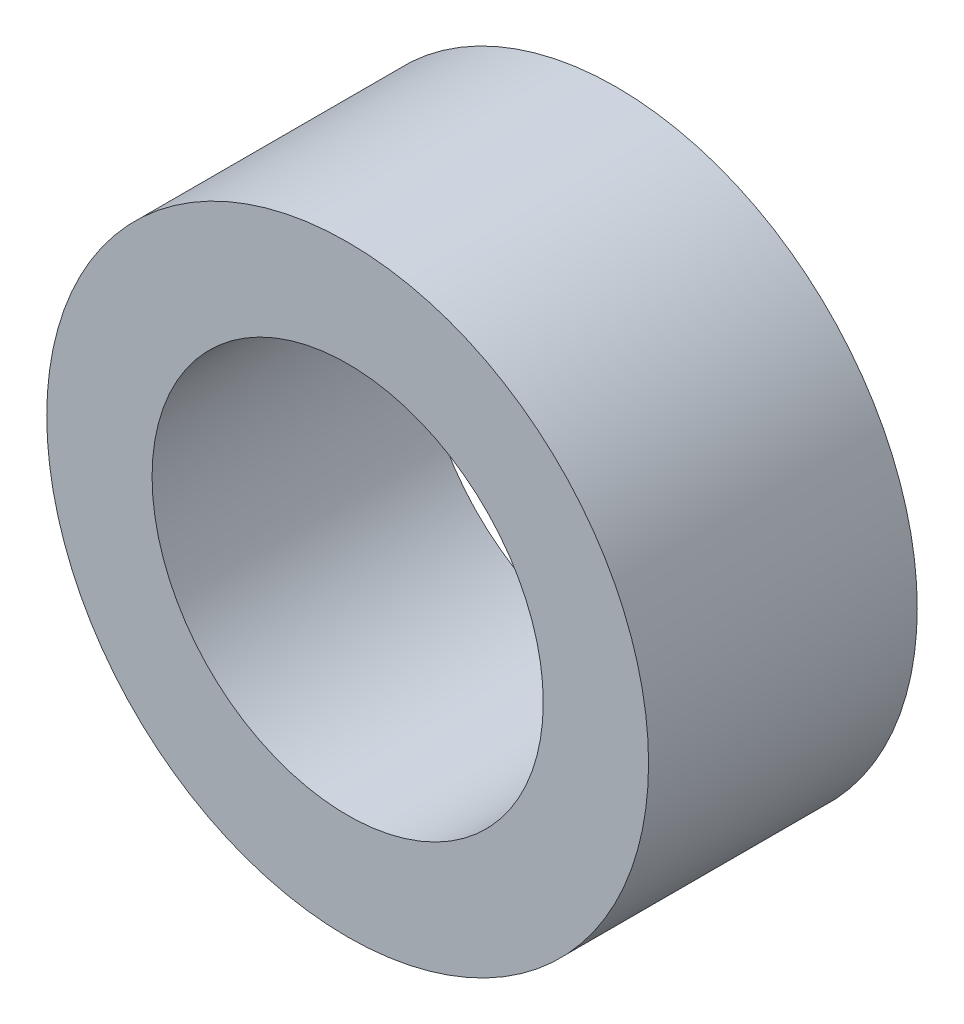
ISO-10303-21;
HEADER;
FILE_DESCRIPTION(('STEP AP214'),'2;1');
FILE_NAME('part.step','',(''),(''),'','','');
FILE_SCHEMA(('AUTOMOTIVE_DESIGN { 1 0 10303 214 1 1 1 1 }'));
ENDSEC;
DATA;
#1=APPLICATION_CONTEXT('core data for automotive mechanical design processes');
#2=APPLICATION_PROTOCOL_DEFINITION('international standard','automotive_design',2000,#1);
#3=PRODUCT_CONTEXT('',#1,'mechanical');
#4=PRODUCT('Part','Part','',(#3));
#5=PRODUCT_RELATED_PRODUCT_CATEGORY('part','',(#4));
#6=PRODUCT_DEFINITION_FORMATION('','',#4);
#7=PRODUCT_DEFINITION_CONTEXT('part definition',#1,'design');
#8=PRODUCT_DEFINITION('design','',#6,#7);
#9=PRODUCT_DEFINITION_SHAPE('','',#8);
#10=(LENGTH_UNIT() NAMED_UNIT(*) SI_UNIT(.MILLI.,.METRE.));
#11=(NAMED_UNIT(*) PLANE_ANGLE_UNIT() SI_UNIT($,.RADIAN.));
#12=(NAMED_UNIT(*) SI_UNIT($,.STERADIAN.) SOLID_ANGLE_UNIT());
#13=UNCERTAINTY_MEASURE_WITH_UNIT(LENGTH_MEASURE(1.E-05),#10,'distance_accuracy_value','');
#14=(GEOMETRIC_REPRESENTATION_CONTEXT(3) GLOBAL_UNCERTAINTY_ASSIGNED_CONTEXT((#13)) GLOBAL_UNIT_ASSIGNED_CONTEXT((#10,
#11,#12)) REPRESENTATION_CONTEXT('',''));
#15=CARTESIAN_POINT('',(0.,0.,0.));
#16=DIRECTION('',(0.,0.,1.));
#17=DIRECTION('',(1.,0.,0.));
#18=AXIS2_PLACEMENT_3D('',#15,#16,#17);
#19=CARTESIAN_POINT('',(0.,0.,9.525));
#20=DIRECTION('',(0.,0.,1.));
#21=DIRECTION('',(1.,0.,0.));
#22=AXIS2_PLACEMENT_3D('',#19,#20,#21);
#23=PLANE('',#22);
#24=CARTESIAN_POINT('',(0.,0.,9.525));
#25=DIRECTION('',(0.,0.,1.));
#26=DIRECTION('',(1.,0.,0.));
#27=AXIS2_PLACEMENT_3D('',#24,#25,#26);
#28=CIRCLE('',#27,10.668);
#29=CARTESIAN_POINT('',(10.668,0.,9.525));
#30=VERTEX_POINT('',#29);
#31=EDGE_CURVE('E10',#30,#30,#28,.T.);
#32=ORIENTED_EDGE('',*,*,#31,.T.);
#33=EDGE_LOOP('',(#32));
#34=FACE_BOUND('',#33,.T.);
#35=CARTESIAN_POINT('',(0.,0.,9.525));
#36=DIRECTION('',(0.,0.,1.));
#37=DIRECTION('',(1.,0.,0.));
#38=AXIS2_PLACEMENT_3D('',#35,#36,#37);
#39=CIRCLE('',#38,6.9342);
#40=CARTESIAN_POINT('',(6.9342,0.,9.525));
#41=VERTEX_POINT('',#40);
#42=EDGE_CURVE('E42',#41,#41,#39,.T.);
#43=ORIENTED_EDGE('',*,*,#42,.F.);
#44=EDGE_LOOP('',(#43));
#45=FACE_BOUND('',#44,.T.);
#46=ADVANCED_FACE('F31',(#34,#45),#23,.T.);
#47=CARTESIAN_POINT('',(0.,0.,0.));
#48=DIRECTION('',(0.,0.,1.));
#49=DIRECTION('',(1.,0.,0.));
#50=AXIS2_PLACEMENT_3D('',#47,#48,#49);
#51=PLANE('',#50);
#52=CARTESIAN_POINT('',(0.,0.,0.));
#53=DIRECTION('',(0.,0.,1.));
#54=DIRECTION('',(1.,0.,0.));
#55=AXIS2_PLACEMENT_3D('',#52,#53,#54);
#56=CIRCLE('',#55,10.668);
#57=CARTESIAN_POINT('',(10.668,0.,0.));
#58=VERTEX_POINT('',#57);
#59=EDGE_CURVE('E35',#58,#58,#56,.T.);
#60=ORIENTED_EDGE('',*,*,#59,.F.);
#61=EDGE_LOOP('',(#60));
#62=FACE_BOUND('',#61,.T.);
#63=CARTESIAN_POINT('',(0.,0.,0.));
#64=DIRECTION('',(0.,0.,1.));
#65=DIRECTION('',(1.,0.,0.));
#66=AXIS2_PLACEMENT_3D('',#63,#64,#65);
#67=CIRCLE('',#66,6.9342);
#68=CARTESIAN_POINT('',(6.9342,0.,0.));
#69=VERTEX_POINT('',#68);
#70=EDGE_CURVE('E44',#69,#69,#67,.T.);
#71=ORIENTED_EDGE('',*,*,#70,.T.);
#72=EDGE_LOOP('',(#71));
#73=FACE_BOUND('',#72,.T.);
#74=ADVANCED_FACE('F54',(#62,#73),#51,.F.);
#75=CARTESIAN_POINT('',(0.,0.,9.525));
#76=DIRECTION('',(0.,0.,-1.));
#77=DIRECTION('',(-1.,0.,0.));
#78=AXIS2_PLACEMENT_3D('',#75,#76,#77);
#79=CYLINDRICAL_SURFACE('',#78,10.668);
#80=ORIENTED_EDGE('',*,*,#31,.F.);
#81=EDGE_LOOP('',(#80));
#82=FACE_BOUND('',#81,.T.);
#83=ORIENTED_EDGE('',*,*,#59,.T.);
#84=EDGE_LOOP('',(#83));
#85=FACE_BOUND('',#84,.T.);
#86=ADVANCED_FACE('F33',(#82,#85),#79,.T.);
#87=CARTESIAN_POINT('',(0.,0.,9.525));
#88=DIRECTION('',(0.,0.,-1.));
#89=DIRECTION('',(-1.,0.,0.));
#90=AXIS2_PLACEMENT_3D('',#87,#88,#89);
#91=CYLINDRICAL_SURFACE('',#90,6.9342);
#92=ORIENTED_EDGE('',*,*,#42,.T.);
#93=EDGE_LOOP('',(#92));
#94=FACE_BOUND('',#93,.T.);
#95=ORIENTED_EDGE('',*,*,#70,.F.);
#96=EDGE_LOOP('',(#95));
#97=FACE_BOUND('',#96,.T.);
#98=ADVANCED_FACE('F50',(#94,#97),#91,.F.);
#99=CLOSED_SHELL('',(#46,#74,#86,#98));
#100=MANIFOLD_SOLID_BREP('B2',#99);
#101=ADVANCED_BREP_SHAPE_REPRESENTATION('',(#18,#100),#14);
#102=SHAPE_DEFINITION_REPRESENTATION(#9,#101);
ENDSEC;
END-ISO-10303-21;
